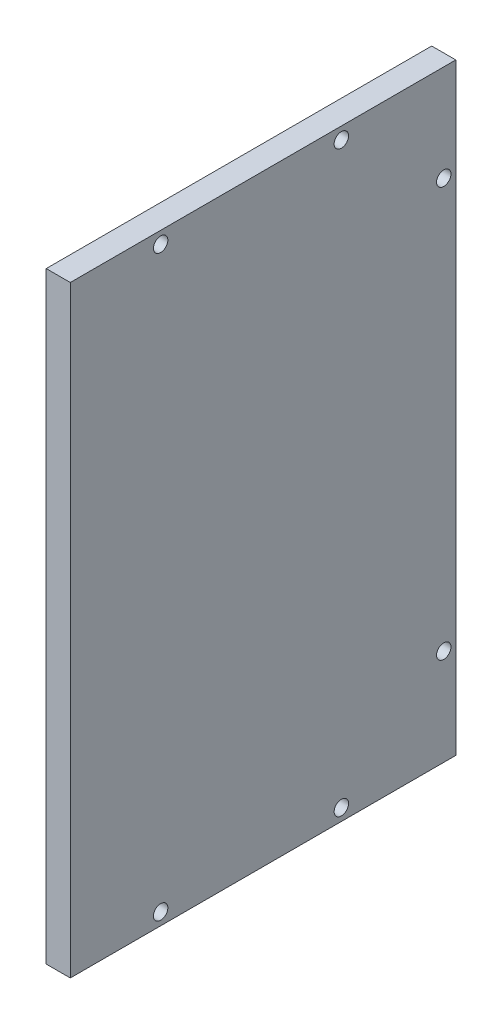
ISO-10303-21;
HEADER;
FILE_DESCRIPTION(('STEP AP214'),'2;1');
FILE_NAME('part.step','',(''),(''),'','','');
FILE_SCHEMA(('AUTOMOTIVE_DESIGN { 1 0 10303 214 1 1 1 1 }'));
ENDSEC;
DATA;
#1=APPLICATION_CONTEXT('core data for automotive mechanical design processes');
#2=APPLICATION_PROTOCOL_DEFINITION('international standard','automotive_design',2000,#1);
#3=PRODUCT_CONTEXT('',#1,'mechanical');
#4=PRODUCT('Part','Part','',(#3));
#5=PRODUCT_RELATED_PRODUCT_CATEGORY('part','',(#4));
#6=PRODUCT_DEFINITION_FORMATION('','',#4);
#7=PRODUCT_DEFINITION_CONTEXT('part definition',#1,'design');
#8=PRODUCT_DEFINITION('design','',#6,#7);
#9=PRODUCT_DEFINITION_SHAPE('','',#8);
#10=(LENGTH_UNIT() NAMED_UNIT(*) SI_UNIT(.MILLI.,.METRE.));
#11=(NAMED_UNIT(*) PLANE_ANGLE_UNIT() SI_UNIT($,.RADIAN.));
#12=(NAMED_UNIT(*) SI_UNIT($,.STERADIAN.) SOLID_ANGLE_UNIT());
#13=UNCERTAINTY_MEASURE_WITH_UNIT(LENGTH_MEASURE(1.E-05),#10,'distance_accuracy_value','');
#14=(GEOMETRIC_REPRESENTATION_CONTEXT(3) GLOBAL_UNCERTAINTY_ASSIGNED_CONTEXT((#13)) GLOBAL_UNIT_ASSIGNED_CONTEXT((#10,
#11,#12)) REPRESENTATION_CONTEXT('',''));
#15=CARTESIAN_POINT('',(0.,0.,0.));
#16=DIRECTION('',(0.,0.,1.));
#17=DIRECTION('',(1.,0.,0.));
#18=AXIS2_PLACEMENT_3D('',#15,#16,#17);
#19=CARTESIAN_POINT('',(6.35,-79.375,-50.8));
#20=DIRECTION('',(0.,0.,1.));
#21=DIRECTION('',(1.,0.,0.));
#22=AXIS2_PLACEMENT_3D('',#19,#20,#21);
#23=PLANE('',#22);
#24=DIRECTION('',(0.,1.,0.));
#25=VECTOR('',#24,1.);
#26=CARTESIAN_POINT('',(0.,-79.375,-50.8));
#27=LINE('',#26,#25);
#28=CARTESIAN_POINT('',(0.,-79.375,-50.8));
#29=VERTEX_POINT('',#28);
#30=CARTESIAN_POINT('',(0.,79.375,-50.8));
#31=VERTEX_POINT('',#30);
#32=EDGE_CURVE('E96',#29,#31,#27,.T.);
#33=ORIENTED_EDGE('',*,*,#32,.T.);
#34=DIRECTION('',(-1.,0.,0.));
#35=VECTOR('',#34,1.);
#36=CARTESIAN_POINT('',(6.35,79.375,-50.8));
#37=LINE('',#36,#35);
#38=CARTESIAN_POINT('',(6.35,79.375,-50.8));
#39=VERTEX_POINT('',#38);
#40=EDGE_CURVE('E11',#39,#31,#37,.T.);
#41=ORIENTED_EDGE('',*,*,#40,.F.);
#42=DIRECTION('',(0.,1.,0.));
#43=VECTOR('',#42,1.);
#44=CARTESIAN_POINT('',(6.35,-79.375,-50.8));
#45=LINE('',#44,#43);
#46=CARTESIAN_POINT('',(6.35,-79.375,-50.8));
#47=VERTEX_POINT('',#46);
#48=EDGE_CURVE('E84',#47,#39,#45,.T.);
#49=ORIENTED_EDGE('',*,*,#48,.F.);
#50=DIRECTION('',(-1.,0.,0.));
#51=VECTOR('',#50,1.);
#52=CARTESIAN_POINT('',(6.35,-79.375,-50.8));
#53=LINE('',#52,#51);
#54=EDGE_CURVE('E92',#47,#29,#53,.T.);
#55=ORIENTED_EDGE('',*,*,#54,.T.);
#56=EDGE_LOOP('',(#33,#41,#49,#55));
#57=FACE_BOUND('',#56,.T.);
#58=ADVANCED_FACE('F33',(#57),#23,.F.);
#59=CARTESIAN_POINT('',(6.35,79.375,50.8));
#60=DIRECTION('',(0.,-1.,0.));
#61=DIRECTION('',(0.,0.,-1.));
#62=AXIS2_PLACEMENT_3D('',#59,#60,#61);
#63=PLANE('',#62);
#64=DIRECTION('',(0.,0.,1.));
#65=VECTOR('',#64,1.);
#66=CARTESIAN_POINT('',(0.,79.375,50.8));
#67=LINE('',#66,#65);
#68=CARTESIAN_POINT('',(0.,79.375,50.8));
#69=VERTEX_POINT('',#68);
#70=EDGE_CURVE('E88',#31,#69,#67,.T.);
#71=ORIENTED_EDGE('',*,*,#70,.T.);
#72=DIRECTION('',(-1.,0.,0.));
#73=VECTOR('',#72,1.);
#74=CARTESIAN_POINT('',(6.35,79.375,50.8));
#75=LINE('',#74,#73);
#76=CARTESIAN_POINT('',(6.35,79.375,50.8));
#77=VERTEX_POINT('',#76);
#78=EDGE_CURVE('E41',#77,#69,#75,.T.);
#79=ORIENTED_EDGE('',*,*,#78,.F.);
#80=DIRECTION('',(0.,0.,1.));
#81=VECTOR('',#80,1.);
#82=CARTESIAN_POINT('',(6.35,79.375,50.8));
#83=LINE('',#82,#81);
#84=EDGE_CURVE('E79',#39,#77,#83,.T.);
#85=ORIENTED_EDGE('',*,*,#84,.F.);
#86=ORIENTED_EDGE('',*,*,#40,.T.);
#87=EDGE_LOOP('',(#71,#79,#85,#86));
#88=FACE_BOUND('',#87,.T.);
#89=ADVANCED_FACE('F87',(#88),#63,.F.);
#90=CARTESIAN_POINT('',(6.35,-79.375,50.8));
#91=DIRECTION('',(0.,0.,-1.));
#92=DIRECTION('',(-1.,0.,0.));
#93=AXIS2_PLACEMENT_3D('',#90,#91,#92);
#94=PLANE('',#93);
#95=DIRECTION('',(0.,-1.,0.));
#96=VECTOR('',#95,1.);
#97=CARTESIAN_POINT('',(0.,-79.375,50.8));
#98=LINE('',#97,#96);
#99=CARTESIAN_POINT('',(0.,-79.375,50.8));
#100=VERTEX_POINT('',#99);
#101=EDGE_CURVE('E66',#69,#100,#98,.T.);
#102=ORIENTED_EDGE('',*,*,#101,.T.);
#103=DIRECTION('',(-1.,0.,0.));
#104=VECTOR('',#103,1.);
#105=CARTESIAN_POINT('',(6.35,-79.375,50.8));
#106=LINE('',#105,#104);
#107=CARTESIAN_POINT('',(6.35,-79.375,50.8));
#108=VERTEX_POINT('',#107);
#109=EDGE_CURVE('E89',#108,#100,#106,.T.);
#110=ORIENTED_EDGE('',*,*,#109,.F.);
#111=DIRECTION('',(0.,-1.,0.));
#112=VECTOR('',#111,1.);
#113=CARTESIAN_POINT('',(6.35,-79.375,50.8));
#114=LINE('',#113,#112);
#115=EDGE_CURVE('E82',#77,#108,#114,.T.);
#116=ORIENTED_EDGE('',*,*,#115,.F.);
#117=ORIENTED_EDGE('',*,*,#78,.T.);
#118=EDGE_LOOP('',(#102,#110,#116,#117));
#119=FACE_BOUND('',#118,.T.);
#120=ADVANCED_FACE('F90',(#119),#94,.F.);
#121=CARTESIAN_POINT('',(6.35,-79.375,50.8));
#122=DIRECTION('',(0.,1.,0.));
#123=DIRECTION('',(0.,0.,1.));
#124=AXIS2_PLACEMENT_3D('',#121,#122,#123);
#125=PLANE('',#124);
#126=DIRECTION('',(0.,0.,-1.));
#127=VECTOR('',#126,1.);
#128=CARTESIAN_POINT('',(0.,-79.375,50.8));
#129=LINE('',#128,#127);
#130=EDGE_CURVE('E72',#100,#29,#129,.T.);
#131=ORIENTED_EDGE('',*,*,#130,.T.);
#132=ORIENTED_EDGE('',*,*,#54,.F.);
#133=DIRECTION('',(0.,0.,-1.));
#134=VECTOR('',#133,1.);
#135=CARTESIAN_POINT('',(6.35,-79.375,50.8));
#136=LINE('',#135,#134);
#137=EDGE_CURVE('E49',#108,#47,#136,.T.);
#138=ORIENTED_EDGE('',*,*,#137,.F.);
#139=ORIENTED_EDGE('',*,*,#109,.T.);
#140=EDGE_LOOP('',(#131,#132,#138,#139));
#141=FACE_BOUND('',#140,.T.);
#142=ADVANCED_FACE('F104',(#141),#125,.F.);
#143=CARTESIAN_POINT('',(6.35,0.,0.));
#144=DIRECTION('',(-1.,0.,0.));
#145=DIRECTION('',(0.,0.,1.));
#146=AXIS2_PLACEMENT_3D('',#143,#144,#145);
#147=PLANE('',#146);
#148=CARTESIAN_POINT('',(6.34999999999999,76.2,-20.6375));
#149=DIRECTION('',(-1.,0.,0.));
#150=DIRECTION('',(0.,0.,1.));
#151=AXIS2_PLACEMENT_3D('',#148,#149,#150);
#152=CIRCLE('',#151,1.89864999999999);
#153=CARTESIAN_POINT('',(6.34999999999999,76.2,-18.73885));
#154=VERTEX_POINT('',#153);
#155=EDGE_CURVE('E139',#154,#154,#152,.T.);
#156=ORIENTED_EDGE('',*,*,#155,.T.);
#157=EDGE_LOOP('',(#156));
#158=FACE_BOUND('',#157,.T.);
#159=CARTESIAN_POINT('',(6.34999999999999,76.2,26.9875));
#160=DIRECTION('',(-1.,0.,0.));
#161=DIRECTION('',(0.,0.,1.));
#162=AXIS2_PLACEMENT_3D('',#159,#160,#161);
#163=CIRCLE('',#162,1.89864999999999);
#164=CARTESIAN_POINT('',(6.34999999999999,76.2,28.88615));
#165=VERTEX_POINT('',#164);
#166=EDGE_CURVE('E133',#165,#165,#163,.T.);
#167=ORIENTED_EDGE('',*,*,#166,.T.);
#168=EDGE_LOOP('',(#167));
#169=FACE_BOUND('',#168,.T.);
#170=CARTESIAN_POINT('',(6.34999999999999,-76.2,26.9875));
#171=DIRECTION('',(-1.,0.,0.));
#172=DIRECTION('',(0.,0.,1.));
#173=AXIS2_PLACEMENT_3D('',#170,#171,#172);
#174=CIRCLE('',#173,1.89864999999999);
#175=CARTESIAN_POINT('',(6.34999999999999,-76.2,28.88615));
#176=VERTEX_POINT('',#175);
#177=EDGE_CURVE('E127',#176,#176,#174,.T.);
#178=ORIENTED_EDGE('',*,*,#177,.T.);
#179=EDGE_LOOP('',(#178));
#180=FACE_BOUND('',#179,.T.);
#181=CARTESIAN_POINT('',(6.34999999999999,-76.2,-20.6375));
#182=DIRECTION('',(-1.,0.,0.));
#183=DIRECTION('',(0.,0.,1.));
#184=AXIS2_PLACEMENT_3D('',#181,#182,#183);
#185=CIRCLE('',#184,1.89864999999999);
#186=CARTESIAN_POINT('',(6.34999999999999,-76.2,-18.73885));
#187=VERTEX_POINT('',#186);
#188=EDGE_CURVE('E121',#187,#187,#185,.T.);
#189=ORIENTED_EDGE('',*,*,#188,.T.);
#190=EDGE_LOOP('',(#189));
#191=FACE_BOUND('',#190,.T.);
#192=CARTESIAN_POINT('',(6.34999999999999,-53.975,-47.625));
#193=DIRECTION('',(-1.,0.,0.));
#194=DIRECTION('',(0.,0.,1.));
#195=AXIS2_PLACEMENT_3D('',#192,#193,#194);
#196=CIRCLE('',#195,1.89864999999999);
#197=CARTESIAN_POINT('',(6.34999999999999,-53.975,-45.72635));
#198=VERTEX_POINT('',#197);
#199=EDGE_CURVE('E115',#198,#198,#196,.T.);
#200=ORIENTED_EDGE('',*,*,#199,.T.);
#201=EDGE_LOOP('',(#200));
#202=FACE_BOUND('',#201,.T.);
#203=CARTESIAN_POINT('',(6.34999999999999,53.975,-47.625));
#204=DIRECTION('',(-1.,0.,0.));
#205=DIRECTION('',(0.,0.,1.));
#206=AXIS2_PLACEMENT_3D('',#203,#204,#205);
#207=CIRCLE('',#206,1.89864999999999);
#208=CARTESIAN_POINT('',(6.34999999999999,53.975,-45.72635));
#209=VERTEX_POINT('',#208);
#210=EDGE_CURVE('E99',#209,#209,#207,.T.);
#211=ORIENTED_EDGE('',*,*,#210,.T.);
#212=EDGE_LOOP('',(#211));
#213=FACE_BOUND('',#212,.T.);
#214=ORIENTED_EDGE('',*,*,#48,.T.);
#215=ORIENTED_EDGE('',*,*,#84,.T.);
#216=ORIENTED_EDGE('',*,*,#115,.T.);
#217=ORIENTED_EDGE('',*,*,#137,.T.);
#218=EDGE_LOOP('',(#214,#215,#216,#217));
#219=FACE_BOUND('',#218,.T.);
#220=ADVANCED_FACE('F80',(#158,#169,#180,#191,#202,#213,#219),#147,.F.);
#221=CARTESIAN_POINT('',(0.,0.,0.));
#222=DIRECTION('',(-1.,0.,0.));
#223=DIRECTION('',(0.,0.,1.));
#224=AXIS2_PLACEMENT_3D('',#221,#222,#223);
#225=PLANE('',#224);
#226=CARTESIAN_POINT('',(0.,76.2,-20.6375));
#227=DIRECTION('',(-1.,0.,0.));
#228=DIRECTION('',(0.,0.,1.));
#229=AXIS2_PLACEMENT_3D('',#226,#227,#228);
#230=CIRCLE('',#229,1.89864999999999);
#231=CARTESIAN_POINT('',(0.,76.2,-18.73885));
#232=VERTEX_POINT('',#231);
#233=EDGE_CURVE('E142',#232,#232,#230,.T.);
#234=ORIENTED_EDGE('',*,*,#233,.F.);
#235=EDGE_LOOP('',(#234));
#236=FACE_BOUND('',#235,.T.);
#237=CARTESIAN_POINT('',(0.,76.2,26.9875));
#238=DIRECTION('',(-1.,0.,0.));
#239=DIRECTION('',(0.,0.,1.));
#240=AXIS2_PLACEMENT_3D('',#237,#238,#239);
#241=CIRCLE('',#240,1.89864999999999);
#242=CARTESIAN_POINT('',(0.,76.2,28.88615));
#243=VERTEX_POINT('',#242);
#244=EDGE_CURVE('E136',#243,#243,#241,.T.);
#245=ORIENTED_EDGE('',*,*,#244,.F.);
#246=EDGE_LOOP('',(#245));
#247=FACE_BOUND('',#246,.T.);
#248=CARTESIAN_POINT('',(0.,-76.2,26.9875));
#249=DIRECTION('',(-1.,0.,0.));
#250=DIRECTION('',(0.,0.,1.));
#251=AXIS2_PLACEMENT_3D('',#248,#249,#250);
#252=CIRCLE('',#251,1.89864999999999);
#253=CARTESIAN_POINT('',(0.,-76.2,28.88615));
#254=VERTEX_POINT('',#253);
#255=EDGE_CURVE('E130',#254,#254,#252,.T.);
#256=ORIENTED_EDGE('',*,*,#255,.F.);
#257=EDGE_LOOP('',(#256));
#258=FACE_BOUND('',#257,.T.);
#259=CARTESIAN_POINT('',(0.,-76.2,-20.6375));
#260=DIRECTION('',(-1.,0.,0.));
#261=DIRECTION('',(0.,0.,1.));
#262=AXIS2_PLACEMENT_3D('',#259,#260,#261);
#263=CIRCLE('',#262,1.89864999999999);
#264=CARTESIAN_POINT('',(0.,-76.2,-18.73885));
#265=VERTEX_POINT('',#264);
#266=EDGE_CURVE('E124',#265,#265,#263,.T.);
#267=ORIENTED_EDGE('',*,*,#266,.F.);
#268=EDGE_LOOP('',(#267));
#269=FACE_BOUND('',#268,.T.);
#270=CARTESIAN_POINT('',(0.,-53.975,-47.625));
#271=DIRECTION('',(-1.,0.,0.));
#272=DIRECTION('',(0.,0.,1.));
#273=AXIS2_PLACEMENT_3D('',#270,#271,#272);
#274=CIRCLE('',#273,1.89864999999999);
#275=CARTESIAN_POINT('',(0.,-53.975,-45.72635));
#276=VERTEX_POINT('',#275);
#277=EDGE_CURVE('E118',#276,#276,#274,.T.);
#278=ORIENTED_EDGE('',*,*,#277,.F.);
#279=EDGE_LOOP('',(#278));
#280=FACE_BOUND('',#279,.T.);
#281=CARTESIAN_POINT('',(0.,53.975,-47.625));
#282=DIRECTION('',(-1.,0.,0.));
#283=DIRECTION('',(0.,0.,1.));
#284=AXIS2_PLACEMENT_3D('',#281,#282,#283);
#285=CIRCLE('',#284,1.89864999999999);
#286=CARTESIAN_POINT('',(0.,53.975,-45.72635));
#287=VERTEX_POINT('',#286);
#288=EDGE_CURVE('E112',#287,#287,#285,.T.);
#289=ORIENTED_EDGE('',*,*,#288,.F.);
#290=EDGE_LOOP('',(#289));
#291=FACE_BOUND('',#290,.T.);
#292=ORIENTED_EDGE('',*,*,#32,.F.);
#293=ORIENTED_EDGE('',*,*,#130,.F.);
#294=ORIENTED_EDGE('',*,*,#101,.F.);
#295=ORIENTED_EDGE('',*,*,#70,.F.);
#296=EDGE_LOOP('',(#292,#293,#294,#295));
#297=FACE_BOUND('',#296,.T.);
#298=ADVANCED_FACE('F107',(#236,#247,#258,#269,#280,#291,#297),#225,.T.);
#299=CARTESIAN_POINT('',(0.,53.975,-47.625));
#300=DIRECTION('',(-1.,0.,0.));
#301=DIRECTION('',(0.,0.,1.));
#302=AXIS2_PLACEMENT_3D('',#299,#300,#301);
#303=CYLINDRICAL_SURFACE('',#302,1.89864999999999);
#304=ORIENTED_EDGE('',*,*,#210,.F.);
#305=EDGE_LOOP('',(#304));
#306=FACE_BOUND('',#305,.T.);
#307=ORIENTED_EDGE('',*,*,#288,.T.);
#308=EDGE_LOOP('',(#307));
#309=FACE_BOUND('',#308,.T.);
#310=ADVANCED_FACE('F150',(#306,#309),#303,.F.);
#311=CARTESIAN_POINT('',(0.,-53.975,-47.625));
#312=DIRECTION('',(-1.,0.,0.));
#313=DIRECTION('',(0.,0.,1.));
#314=AXIS2_PLACEMENT_3D('',#311,#312,#313);
#315=CYLINDRICAL_SURFACE('',#314,1.89864999999999);
#316=ORIENTED_EDGE('',*,*,#199,.F.);
#317=EDGE_LOOP('',(#316));
#318=FACE_BOUND('',#317,.T.);
#319=ORIENTED_EDGE('',*,*,#277,.T.);
#320=EDGE_LOOP('',(#319));
#321=FACE_BOUND('',#320,.T.);
#322=ADVANCED_FACE('F163',(#318,#321),#315,.F.);
#323=CARTESIAN_POINT('',(0.,-76.2,-20.6375));
#324=DIRECTION('',(-1.,0.,0.));
#325=DIRECTION('',(0.,0.,1.));
#326=AXIS2_PLACEMENT_3D('',#323,#324,#325);
#327=CYLINDRICAL_SURFACE('',#326,1.89864999999999);
#328=ORIENTED_EDGE('',*,*,#188,.F.);
#329=EDGE_LOOP('',(#328));
#330=FACE_BOUND('',#329,.T.);
#331=ORIENTED_EDGE('',*,*,#266,.T.);
#332=EDGE_LOOP('',(#331));
#333=FACE_BOUND('',#332,.T.);
#334=ADVANCED_FACE('F170',(#330,#333),#327,.F.);
#335=CARTESIAN_POINT('',(0.,-76.2,26.9875));
#336=DIRECTION('',(-1.,0.,0.));
#337=DIRECTION('',(0.,0.,1.));
#338=AXIS2_PLACEMENT_3D('',#335,#336,#337);
#339=CYLINDRICAL_SURFACE('',#338,1.89864999999999);
#340=ORIENTED_EDGE('',*,*,#177,.F.);
#341=EDGE_LOOP('',(#340));
#342=FACE_BOUND('',#341,.T.);
#343=ORIENTED_EDGE('',*,*,#255,.T.);
#344=EDGE_LOOP('',(#343));
#345=FACE_BOUND('',#344,.T.);
#346=ADVANCED_FACE('F204',(#342,#345),#339,.F.);
#347=CARTESIAN_POINT('',(0.,76.2,26.9875));
#348=DIRECTION('',(-1.,0.,0.));
#349=DIRECTION('',(0.,0.,1.));
#350=AXIS2_PLACEMENT_3D('',#347,#348,#349);
#351=CYLINDRICAL_SURFACE('',#350,1.89864999999999);
#352=ORIENTED_EDGE('',*,*,#166,.F.);
#353=EDGE_LOOP('',(#352));
#354=FACE_BOUND('',#353,.T.);
#355=ORIENTED_EDGE('',*,*,#244,.T.);
#356=EDGE_LOOP('',(#355));
#357=FACE_BOUND('',#356,.T.);
#358=ADVANCED_FACE('F209',(#354,#357),#351,.F.);
#359=CARTESIAN_POINT('',(0.,76.2,-20.6375));
#360=DIRECTION('',(-1.,0.,0.));
#361=DIRECTION('',(0.,0.,1.));
#362=AXIS2_PLACEMENT_3D('',#359,#360,#361);
#363=CYLINDRICAL_SURFACE('',#362,1.89864999999999);
#364=ORIENTED_EDGE('',*,*,#155,.F.);
#365=EDGE_LOOP('',(#364));
#366=FACE_BOUND('',#365,.T.);
#367=ORIENTED_EDGE('',*,*,#233,.T.);
#368=EDGE_LOOP('',(#367));
#369=FACE_BOUND('',#368,.T.);
#370=ADVANCED_FACE('F146',(#366,#369),#363,.F.);
#371=CLOSED_SHELL('',(#58,#89,#120,#142,#220,#298,#310,#322,#334,#346,#358,#370));
#372=MANIFOLD_SOLID_BREP('B2',#371);
#373=ADVANCED_BREP_SHAPE_REPRESENTATION('',(#18,#372),#14);
#374=SHAPE_DEFINITION_REPRESENTATION(#9,#373);
ENDSEC;
END-ISO-10303-21;
